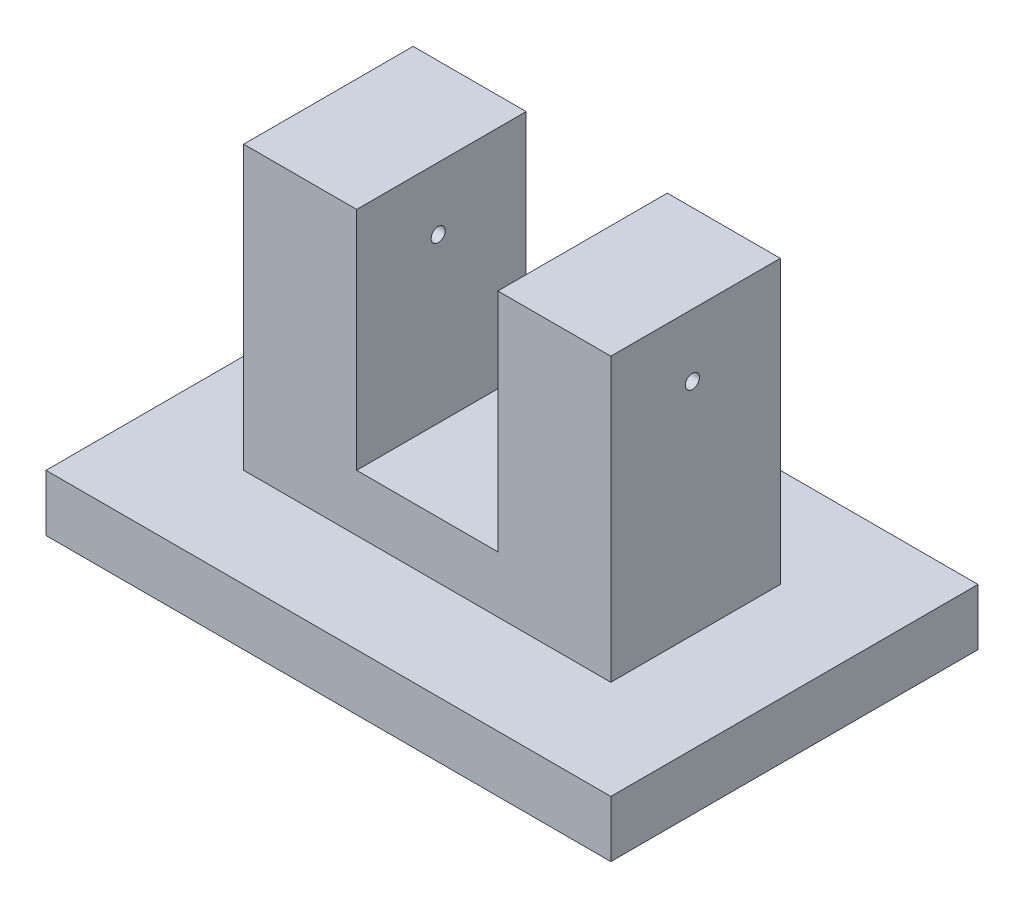
ISO-10303-21;
HEADER;
FILE_DESCRIPTION(('STEP AP214'),'2;1');
FILE_NAME('part.step','',(''),(''),'','','');
FILE_SCHEMA(('AUTOMOTIVE_DESIGN { 1 0 10303 214 1 1 1 1 }'));
ENDSEC;
DATA;
#1=APPLICATION_CONTEXT('core data for automotive mechanical design processes');
#2=APPLICATION_PROTOCOL_DEFINITION('international standard','automotive_design',2000,#1);
#3=PRODUCT_CONTEXT('',#1,'mechanical');
#4=PRODUCT('Part','Part','',(#3));
#5=PRODUCT_RELATED_PRODUCT_CATEGORY('part','',(#4));
#6=PRODUCT_DEFINITION_FORMATION('','',#4);
#7=PRODUCT_DEFINITION_CONTEXT('part definition',#1,'design');
#8=PRODUCT_DEFINITION('design','',#6,#7);
#9=PRODUCT_DEFINITION_SHAPE('','',#8);
#10=(LENGTH_UNIT() NAMED_UNIT(*) SI_UNIT(.MILLI.,.METRE.));
#11=(NAMED_UNIT(*) PLANE_ANGLE_UNIT() SI_UNIT($,.RADIAN.));
#12=(NAMED_UNIT(*) SI_UNIT($,.STERADIAN.) SOLID_ANGLE_UNIT());
#13=UNCERTAINTY_MEASURE_WITH_UNIT(LENGTH_MEASURE(1.E-05),#10,'distance_accuracy_value','');
#14=(GEOMETRIC_REPRESENTATION_CONTEXT(3) GLOBAL_UNCERTAINTY_ASSIGNED_CONTEXT((#13)) GLOBAL_UNIT_ASSIGNED_CONTEXT((#10,
#11,#12)) REPRESENTATION_CONTEXT('',''));
#15=CARTESIAN_POINT('',(0.,0.,0.));
#16=DIRECTION('',(0.,0.,1.));
#17=DIRECTION('',(1.,0.,0.));
#18=AXIS2_PLACEMENT_3D('',#15,#16,#17);
#19=CARTESIAN_POINT('',(0.,4.,0.));
#20=DIRECTION('',(0.,1.,0.));
#21=DIRECTION('',(0.,0.,1.));
#22=AXIS2_PLACEMENT_3D('',#19,#20,#21);
#23=PLANE('',#22);
#24=DIRECTION('',(1.,0.,0.));
#25=VECTOR('',#24,1.);
#26=CARTESIAN_POINT('',(-10.5202702702703,4.,0.699324324324319));
#27=LINE('',#26,#25);
#28=CARTESIAN_POINT('',(-6.52027027027027,4.,0.699324324324319));
#29=VERTEX_POINT('',#28);
#30=CARTESIAN_POINT('',(-1.52027027027028,4.,0.699324324324319));
#31=VERTEX_POINT('',#30);
#32=EDGE_CURVE('E56',#29,#31,#27,.T.);
#33=ORIENTED_EDGE('',*,*,#32,.T.);
#34=DIRECTION('',(0.,0.,1.));
#35=VECTOR('',#34,1.);
#36=CARTESIAN_POINT('',(-1.52027027027027,4.,0.699324324324319));
#37=LINE('',#36,#35);
#38=CARTESIAN_POINT('',(-1.52027027027028,4.,-5.30067567567568));
#39=VERTEX_POINT('',#38);
#40=EDGE_CURVE('E51',#39,#31,#37,.T.);
#41=ORIENTED_EDGE('',*,*,#40,.F.);
#42=DIRECTION('',(-1.,0.,0.));
#43=VECTOR('',#42,1.);
#44=CARTESIAN_POINT('',(-10.5202702702703,4.,-5.30067567567568));
#45=LINE('',#44,#43);
#46=CARTESIAN_POINT('',(-6.52027027027027,4.,-5.30067567567568));
#47=VERTEX_POINT('',#46);
#48=EDGE_CURVE('E180',#39,#47,#45,.T.);
#49=ORIENTED_EDGE('',*,*,#48,.T.);
#50=DIRECTION('',(0.,0.,-1.));
#51=VECTOR('',#50,1.);
#52=CARTESIAN_POINT('',(-6.52027027027027,4.,-5.30067567567568));
#53=LINE('',#52,#51);
#54=EDGE_CURVE('E161',#29,#47,#53,.T.);
#55=ORIENTED_EDGE('',*,*,#54,.F.);
#56=EDGE_LOOP('',(#33,#41,#49,#55));
#57=FACE_BOUND('',#56,.T.);
#58=ADVANCED_FACE('F35',(#57),#23,.T.);
#59=CARTESIAN_POINT('',(5.97972972972973,2.,-8.80067567567568));
#60=DIRECTION('',(-1.,0.,0.));
#61=DIRECTION('',(0.,0.,1.));
#62=AXIS2_PLACEMENT_3D('',#59,#60,#61);
#63=PLANE('',#62);
#64=DIRECTION('',(0.,0.,-1.));
#65=VECTOR('',#64,1.);
#66=CARTESIAN_POINT('',(5.97972972972973,0.,-8.80067567567568));
#67=LINE('',#66,#65);
#68=CARTESIAN_POINT('',(5.97972972972973,0.,4.19932432432432));
#69=VERTEX_POINT('',#68);
#70=CARTESIAN_POINT('',(5.97972972972973,0.,-8.80067567567568));
#71=VERTEX_POINT('',#70);
#72=EDGE_CURVE('E133',#69,#71,#67,.T.);
#73=ORIENTED_EDGE('',*,*,#72,.T.);
#74=DIRECTION('',(0.,-1.,0.));
#75=VECTOR('',#74,1.);
#76=CARTESIAN_POINT('',(5.97972972972973,2.,-8.80067567567568));
#77=LINE('',#76,#75);
#78=CARTESIAN_POINT('',(5.97972972972973,2.,-8.80067567567568));
#79=VERTEX_POINT('',#78);
#80=EDGE_CURVE('E11',#79,#71,#77,.T.);
#81=ORIENTED_EDGE('',*,*,#80,.F.);
#82=DIRECTION('',(0.,0.,-1.));
#83=VECTOR('',#82,1.);
#84=CARTESIAN_POINT('',(5.97972972972973,2.,-8.80067567567568));
#85=LINE('',#84,#83);
#86=CARTESIAN_POINT('',(5.97972972972973,2.,4.19932432432432));
#87=VERTEX_POINT('',#86);
#88=EDGE_CURVE('E199',#87,#79,#85,.T.);
#89=ORIENTED_EDGE('',*,*,#88,.F.);
#90=DIRECTION('',(0.,-1.,0.));
#91=VECTOR('',#90,1.);
#92=CARTESIAN_POINT('',(5.97972972972973,2.,4.19932432432432));
#93=LINE('',#92,#91);
#94=EDGE_CURVE('E209',#87,#69,#93,.T.);
#95=ORIENTED_EDGE('',*,*,#94,.T.);
#96=EDGE_LOOP('',(#73,#81,#89,#95));
#97=FACE_BOUND('',#96,.T.);
#98=ADVANCED_FACE('F37',(#97),#63,.F.);
#99=CARTESIAN_POINT('',(-14.0202702702703,2.,-8.80067567567568));
#100=DIRECTION('',(0.,0.,1.));
#101=DIRECTION('',(1.,0.,0.));
#102=AXIS2_PLACEMENT_3D('',#99,#100,#101);
#103=PLANE('',#102);
#104=DIRECTION('',(-1.,0.,0.));
#105=VECTOR('',#104,1.);
#106=CARTESIAN_POINT('',(-14.0202702702703,0.,-8.80067567567568));
#107=LINE('',#106,#105);
#108=CARTESIAN_POINT('',(-14.0202702702703,0.,-8.80067567567568));
#109=VERTEX_POINT('',#108);
#110=EDGE_CURVE('E212',#71,#109,#107,.T.);
#111=ORIENTED_EDGE('',*,*,#110,.T.);
#112=DIRECTION('',(0.,-1.,0.));
#113=VECTOR('',#112,1.);
#114=CARTESIAN_POINT('',(-14.0202702702703,2.,-8.80067567567568));
#115=LINE('',#114,#113);
#116=CARTESIAN_POINT('',(-14.0202702702703,2.,-8.80067567567568));
#117=VERTEX_POINT('',#116);
#118=EDGE_CURVE('E44',#117,#109,#115,.T.);
#119=ORIENTED_EDGE('',*,*,#118,.F.);
#120=DIRECTION('',(-1.,0.,0.));
#121=VECTOR('',#120,1.);
#122=CARTESIAN_POINT('',(-14.0202702702703,2.,-8.80067567567568));
#123=LINE('',#122,#121);
#124=EDGE_CURVE('E202',#79,#117,#123,.T.);
#125=ORIENTED_EDGE('',*,*,#124,.F.);
#126=ORIENTED_EDGE('',*,*,#80,.T.);
#127=EDGE_LOOP('',(#111,#119,#125,#126));
#128=FACE_BOUND('',#127,.T.);
#129=ADVANCED_FACE('F243',(#128),#103,.F.);
#130=CARTESIAN_POINT('',(-14.0202702702703,2.,-8.80067567567568));
#131=DIRECTION('',(1.,0.,0.));
#132=DIRECTION('',(0.,0.,-1.));
#133=AXIS2_PLACEMENT_3D('',#130,#131,#132);
#134=PLANE('',#133);
#135=DIRECTION('',(0.,0.,1.));
#136=VECTOR('',#135,1.);
#137=CARTESIAN_POINT('',(-14.0202702702703,0.,-8.80067567567568));
#138=LINE('',#137,#136);
#139=CARTESIAN_POINT('',(-14.0202702702703,0.,4.19932432432432));
#140=VERTEX_POINT('',#139);
#141=EDGE_CURVE('E214',#109,#140,#138,.T.);
#142=ORIENTED_EDGE('',*,*,#141,.T.);
#143=DIRECTION('',(0.,-1.,0.));
#144=VECTOR('',#143,1.);
#145=CARTESIAN_POINT('',(-14.0202702702703,2.,4.19932432432432));
#146=LINE('',#145,#144);
#147=CARTESIAN_POINT('',(-14.0202702702703,2.,4.19932432432432));
#148=VERTEX_POINT('',#147);
#149=EDGE_CURVE('E219',#148,#140,#146,.T.);
#150=ORIENTED_EDGE('',*,*,#149,.F.);
#151=DIRECTION('',(0.,0.,1.));
#152=VECTOR('',#151,1.);
#153=CARTESIAN_POINT('',(-14.0202702702703,2.,-8.80067567567568));
#154=LINE('',#153,#152);
#155=EDGE_CURVE('E205',#117,#148,#154,.T.);
#156=ORIENTED_EDGE('',*,*,#155,.F.);
#157=ORIENTED_EDGE('',*,*,#118,.T.);
#158=EDGE_LOOP('',(#142,#150,#156,#157));
#159=FACE_BOUND('',#158,.T.);
#160=ADVANCED_FACE('F227',(#159),#134,.F.);
#161=CARTESIAN_POINT('',(-14.0202702702703,2.,4.19932432432432));
#162=DIRECTION('',(0.,0.,-1.));
#163=DIRECTION('',(-1.,0.,0.));
#164=AXIS2_PLACEMENT_3D('',#161,#162,#163);
#165=PLANE('',#164);
#166=DIRECTION('',(1.,0.,0.));
#167=VECTOR('',#166,1.);
#168=CARTESIAN_POINT('',(-14.0202702702703,0.,4.19932432432432));
#169=LINE('',#168,#167);
#170=EDGE_CURVE('E203',#140,#69,#169,.T.);
#171=ORIENTED_EDGE('',*,*,#170,.T.);
#172=ORIENTED_EDGE('',*,*,#94,.F.);
#173=DIRECTION('',(1.,0.,0.));
#174=VECTOR('',#173,1.);
#175=CARTESIAN_POINT('',(-14.0202702702703,2.,4.19932432432432));
#176=LINE('',#175,#174);
#177=EDGE_CURVE('E207',#148,#87,#176,.T.);
#178=ORIENTED_EDGE('',*,*,#177,.F.);
#179=ORIENTED_EDGE('',*,*,#149,.T.);
#180=EDGE_LOOP('',(#171,#172,#178,#179));
#181=FACE_BOUND('',#180,.T.);
#182=ADVANCED_FACE('F236',(#181),#165,.F.);
#183=CARTESIAN_POINT('',(0.,2.,0.));
#184=DIRECTION('',(0.,1.,0.));
#185=DIRECTION('',(0.,0.,1.));
#186=AXIS2_PLACEMENT_3D('',#183,#184,#185);
#187=PLANE('',#186);
#188=DIRECTION('',(0.,0.,-1.));
#189=VECTOR('',#188,1.);
#190=CARTESIAN_POINT('',(2.47972972972973,2.,-5.30067567567568));
#191=LINE('',#190,#189);
#192=CARTESIAN_POINT('',(2.47972972972973,2.,0.699324324324319));
#193=VERTEX_POINT('',#192);
#194=CARTESIAN_POINT('',(2.47972972972973,2.,-5.30067567567568));
#195=VERTEX_POINT('',#194);
#196=EDGE_CURVE('E130',#193,#195,#191,.T.);
#197=ORIENTED_EDGE('',*,*,#196,.F.);
#198=DIRECTION('',(1.,0.,0.));
#199=VECTOR('',#198,1.);
#200=CARTESIAN_POINT('',(-10.5202702702703,2.,0.699324324324319));
#201=LINE('',#200,#199);
#202=CARTESIAN_POINT('',(-10.5202702702703,2.,0.699324324324319));
#203=VERTEX_POINT('',#202);
#204=EDGE_CURVE('E182',#203,#193,#201,.T.);
#205=ORIENTED_EDGE('',*,*,#204,.F.);
#206=DIRECTION('',(0.,0.,1.));
#207=VECTOR('',#206,1.);
#208=CARTESIAN_POINT('',(-10.5202702702703,2.,-5.30067567567568));
#209=LINE('',#208,#207);
#210=CARTESIAN_POINT('',(-10.5202702702703,2.,-5.30067567567568));
#211=VERTEX_POINT('',#210);
#212=EDGE_CURVE('E188',#211,#203,#209,.T.);
#213=ORIENTED_EDGE('',*,*,#212,.F.);
#214=DIRECTION('',(-1.,0.,0.));
#215=VECTOR('',#214,1.);
#216=CARTESIAN_POINT('',(-10.5202702702703,2.,-5.30067567567568));
#217=LINE('',#216,#215);
#218=EDGE_CURVE('E186',#195,#211,#217,.T.);
#219=ORIENTED_EDGE('',*,*,#218,.F.);
#220=EDGE_LOOP('',(#197,#205,#213,#219));
#221=FACE_BOUND('',#220,.T.);
#222=ORIENTED_EDGE('',*,*,#88,.T.);
#223=ORIENTED_EDGE('',*,*,#124,.T.);
#224=ORIENTED_EDGE('',*,*,#155,.T.);
#225=ORIENTED_EDGE('',*,*,#177,.T.);
#226=EDGE_LOOP('',(#222,#223,#224,#225));
#227=FACE_BOUND('',#226,.T.);
#228=ADVANCED_FACE('F242',(#221,#227),#187,.T.);
#229=CARTESIAN_POINT('',(0.,0.,0.));
#230=DIRECTION('',(0.,1.,0.));
#231=DIRECTION('',(0.,0.,1.));
#232=AXIS2_PLACEMENT_3D('',#229,#230,#231);
#233=PLANE('',#232);
#234=ORIENTED_EDGE('',*,*,#72,.F.);
#235=ORIENTED_EDGE('',*,*,#170,.F.);
#236=ORIENTED_EDGE('',*,*,#141,.F.);
#237=ORIENTED_EDGE('',*,*,#110,.F.);
#238=EDGE_LOOP('',(#234,#235,#236,#237));
#239=FACE_BOUND('',#238,.T.);
#240=ADVANCED_FACE('F233',(#239),#233,.F.);
#241=CARTESIAN_POINT('',(2.47972972972973,4.,-5.30067567567568));
#242=DIRECTION('',(-1.,0.,0.));
#243=DIRECTION('',(0.,0.,1.));
#244=AXIS2_PLACEMENT_3D('',#241,#242,#243);
#245=PLANE('',#244);
#246=CARTESIAN_POINT('',(2.47972972972973,9.78401799754636,-2.18768703186356));
#247=DIRECTION('',(-1.,0.,0.));
#248=DIRECTION('',(0.,0.,1.));
#249=AXIS2_PLACEMENT_3D('',#246,#247,#248);
#250=CIRCLE('',#249,0.25);
#251=CARTESIAN_POINT('',(2.47972972972973,9.78401799754636,-1.93768703186356));
#252=VERTEX_POINT('',#251);
#253=EDGE_CURVE('E150',#252,#252,#250,.T.);
#254=ORIENTED_EDGE('',*,*,#253,.T.);
#255=EDGE_LOOP('',(#254));
#256=FACE_BOUND('',#255,.T.);
#257=ORIENTED_EDGE('',*,*,#196,.T.);
#258=DIRECTION('',(0.,-1.,0.));
#259=VECTOR('',#258,1.);
#260=CARTESIAN_POINT('',(2.47972972972973,4.,-5.30067567567568));
#261=LINE('',#260,#259);
#262=CARTESIAN_POINT('',(2.47972972972973,12.,-5.30067567567568));
#263=VERTEX_POINT('',#262);
#264=EDGE_CURVE('E124',#263,#195,#261,.T.);
#265=ORIENTED_EDGE('',*,*,#264,.F.);
#266=DIRECTION('',(0.,0.,-1.));
#267=VECTOR('',#266,1.);
#268=CARTESIAN_POINT('',(2.47972972972973,12.,0.699324324324319));
#269=LINE('',#268,#267);
#270=CARTESIAN_POINT('',(2.47972972972973,12.,0.699324324324319));
#271=VERTEX_POINT('',#270);
#272=EDGE_CURVE('E129',#271,#263,#269,.T.);
#273=ORIENTED_EDGE('',*,*,#272,.F.);
#274=DIRECTION('',(0.,-1.,0.));
#275=VECTOR('',#274,1.);
#276=CARTESIAN_POINT('',(2.47972972972973,4.,0.699324324324319));
#277=LINE('',#276,#275);
#278=EDGE_CURVE('E184',#271,#193,#277,.T.);
#279=ORIENTED_EDGE('',*,*,#278,.T.);
#280=EDGE_LOOP('',(#257,#265,#273,#279));
#281=FACE_BOUND('',#280,.T.);
#282=ADVANCED_FACE('F126',(#256,#281),#245,.F.);
#283=CARTESIAN_POINT('',(-10.5202702702703,4.,-5.30067567567568));
#284=DIRECTION('',(0.,0.,1.));
#285=DIRECTION('',(1.,0.,0.));
#286=AXIS2_PLACEMENT_3D('',#283,#284,#285);
#287=PLANE('',#286);
#288=ORIENTED_EDGE('',*,*,#218,.T.);
#289=DIRECTION('',(0.,-1.,0.));
#290=VECTOR('',#289,1.);
#291=CARTESIAN_POINT('',(-10.5202702702703,4.,-5.30067567567568));
#292=LINE('',#291,#290);
#293=CARTESIAN_POINT('',(-10.5202702702703,12.,-5.30067567567568));
#294=VERTEX_POINT('',#293);
#295=EDGE_CURVE('E134',#294,#211,#292,.T.);
#296=ORIENTED_EDGE('',*,*,#295,.F.);
#297=DIRECTION('',(-1.,0.,0.));
#298=VECTOR('',#297,1.);
#299=CARTESIAN_POINT('',(-10.5202702702703,12.,-5.30067567567568));
#300=LINE('',#299,#298);
#301=CARTESIAN_POINT('',(-6.52027027027027,12.,-5.30067567567568));
#302=VERTEX_POINT('',#301);
#303=EDGE_CURVE('E169',#302,#294,#300,.T.);
#304=ORIENTED_EDGE('',*,*,#303,.F.);
#305=DIRECTION('',(0.,-1.,0.));
#306=VECTOR('',#305,1.);
#307=CARTESIAN_POINT('',(-6.52027027027027,12.,-5.30067567567568));
#308=LINE('',#307,#306);
#309=EDGE_CURVE('E172',#302,#47,#308,.T.);
#310=ORIENTED_EDGE('',*,*,#309,.T.);
#311=ORIENTED_EDGE('',*,*,#48,.F.);
#312=DIRECTION('',(0.,-1.,0.));
#313=VECTOR('',#312,1.);
#314=CARTESIAN_POINT('',(-1.52027027027027,12.,-5.30067567567568));
#315=LINE('',#314,#313);
#316=CARTESIAN_POINT('',(-1.52027027027027,12.,-5.30067567567568));
#317=VERTEX_POINT('',#316);
#318=EDGE_CURVE('E140',#317,#39,#315,.T.);
#319=ORIENTED_EDGE('',*,*,#318,.F.);
#320=DIRECTION('',(-1.,0.,0.));
#321=VECTOR('',#320,1.);
#322=CARTESIAN_POINT('',(2.47972972972973,12.,-5.30067567567568));
#323=LINE('',#322,#321);
#324=EDGE_CURVE('E137',#263,#317,#323,.T.);
#325=ORIENTED_EDGE('',*,*,#324,.F.);
#326=ORIENTED_EDGE('',*,*,#264,.T.);
#327=EDGE_LOOP('',(#288,#296,#304,#310,#311,#319,#325,#326));
#328=FACE_BOUND('',#327,.T.);
#329=ADVANCED_FACE('F138',(#328),#287,.F.);
#330=CARTESIAN_POINT('',(-10.5202702702703,4.,-5.30067567567568));
#331=DIRECTION('',(1.,0.,0.));
#332=DIRECTION('',(0.,0.,-1.));
#333=AXIS2_PLACEMENT_3D('',#330,#331,#332);
#334=PLANE('',#333);
#335=CARTESIAN_POINT('',(-10.5202702702703,9.78401799754636,-2.18768703186356));
#336=DIRECTION('',(-1.,0.,0.));
#337=DIRECTION('',(0.,0.,1.));
#338=AXIS2_PLACEMENT_3D('',#335,#336,#337);
#339=CIRCLE('',#338,0.25);
#340=CARTESIAN_POINT('',(-10.5202702702703,9.78401799754636,-1.93768703186356));
#341=VERTEX_POINT('',#340);
#342=EDGE_CURVE('E414',#341,#341,#339,.T.);
#343=ORIENTED_EDGE('',*,*,#342,.F.);
#344=EDGE_LOOP('',(#343));
#345=FACE_BOUND('',#344,.T.);
#346=ORIENTED_EDGE('',*,*,#212,.T.);
#347=DIRECTION('',(0.,-1.,0.));
#348=VECTOR('',#347,1.);
#349=CARTESIAN_POINT('',(-10.5202702702703,4.,0.699324324324319));
#350=LINE('',#349,#348);
#351=CARTESIAN_POINT('',(-10.5202702702703,12.,0.699324324324319));
#352=VERTEX_POINT('',#351);
#353=EDGE_CURVE('E194',#352,#203,#350,.T.);
#354=ORIENTED_EDGE('',*,*,#353,.F.);
#355=DIRECTION('',(0.,0.,1.));
#356=VECTOR('',#355,1.);
#357=CARTESIAN_POINT('',(-10.5202702702703,12.,-5.30067567567568));
#358=LINE('',#357,#356);
#359=EDGE_CURVE('E162',#294,#352,#358,.T.);
#360=ORIENTED_EDGE('',*,*,#359,.F.);
#361=ORIENTED_EDGE('',*,*,#295,.T.);
#362=EDGE_LOOP('',(#346,#354,#360,#361));
#363=FACE_BOUND('',#362,.T.);
#364=ADVANCED_FACE('F261',(#345,#363),#334,.F.);
#365=CARTESIAN_POINT('',(-10.5202702702703,4.,0.699324324324319));
#366=DIRECTION('',(0.,0.,-1.));
#367=DIRECTION('',(-1.,0.,0.));
#368=AXIS2_PLACEMENT_3D('',#365,#366,#367);
#369=PLANE('',#368);
#370=ORIENTED_EDGE('',*,*,#204,.T.);
#371=ORIENTED_EDGE('',*,*,#278,.F.);
#372=DIRECTION('',(1.,0.,0.));
#373=VECTOR('',#372,1.);
#374=CARTESIAN_POINT('',(2.47972972972973,12.,0.699324324324319));
#375=LINE('',#374,#373);
#376=CARTESIAN_POINT('',(-1.52027027027027,12.,0.699324324324319));
#377=VERTEX_POINT('',#376);
#378=EDGE_CURVE('E148',#377,#271,#375,.T.);
#379=ORIENTED_EDGE('',*,*,#378,.F.);
#380=DIRECTION('',(0.,-1.,0.));
#381=VECTOR('',#380,1.);
#382=CARTESIAN_POINT('',(-1.52027027027027,12.,0.699324324324319));
#383=LINE('',#382,#381);
#384=EDGE_CURVE('E156',#377,#31,#383,.T.);
#385=ORIENTED_EDGE('',*,*,#384,.T.);
#386=ORIENTED_EDGE('',*,*,#32,.F.);
#387=DIRECTION('',(0.,-1.,0.));
#388=VECTOR('',#387,1.);
#389=CARTESIAN_POINT('',(-6.52027027027027,12.,0.699324324324319));
#390=LINE('',#389,#388);
#391=CARTESIAN_POINT('',(-6.52027027027027,12.,0.699324324324319));
#392=VERTEX_POINT('',#391);
#393=EDGE_CURVE('E177',#392,#29,#390,.T.);
#394=ORIENTED_EDGE('',*,*,#393,.F.);
#395=DIRECTION('',(1.,0.,0.));
#396=VECTOR('',#395,1.);
#397=CARTESIAN_POINT('',(-10.5202702702703,12.,0.699324324324319));
#398=LINE('',#397,#396);
#399=EDGE_CURVE('E165',#352,#392,#398,.T.);
#400=ORIENTED_EDGE('',*,*,#399,.F.);
#401=ORIENTED_EDGE('',*,*,#353,.T.);
#402=EDGE_LOOP('',(#370,#371,#379,#385,#386,#394,#400,#401));
#403=FACE_BOUND('',#402,.T.);
#404=ADVANCED_FACE('F258',(#403),#369,.F.);
#405=CARTESIAN_POINT('',(-6.52027027027027,12.,-5.30067567567568));
#406=DIRECTION('',(-1.,0.,0.));
#407=DIRECTION('',(0.,0.,1.));
#408=AXIS2_PLACEMENT_3D('',#405,#406,#407);
#409=PLANE('',#408);
#410=CARTESIAN_POINT('',(-6.52027027027027,9.78401799754636,-2.18768703186356));
#411=DIRECTION('',(-1.,0.,0.));
#412=DIRECTION('',(0.,0.,1.));
#413=AXIS2_PLACEMENT_3D('',#410,#411,#412);
#414=CIRCLE('',#413,0.25);
#415=CARTESIAN_POINT('',(-6.52027027027027,9.78401799754636,-1.93768703186356));
#416=VERTEX_POINT('',#415);
#417=EDGE_CURVE('E417',#416,#416,#414,.T.);
#418=ORIENTED_EDGE('',*,*,#417,.T.);
#419=EDGE_LOOP('',(#418));
#420=FACE_BOUND('',#419,.T.);
#421=ORIENTED_EDGE('',*,*,#54,.T.);
#422=ORIENTED_EDGE('',*,*,#309,.F.);
#423=DIRECTION('',(0.,0.,-1.));
#424=VECTOR('',#423,1.);
#425=CARTESIAN_POINT('',(-6.52027027027027,12.,-5.30067567567568));
#426=LINE('',#425,#424);
#427=EDGE_CURVE('E167',#392,#302,#426,.T.);
#428=ORIENTED_EDGE('',*,*,#427,.F.);
#429=ORIENTED_EDGE('',*,*,#393,.T.);
#430=EDGE_LOOP('',(#421,#422,#428,#429));
#431=FACE_BOUND('',#430,.T.);
#432=ADVANCED_FACE('F256',(#420,#431),#409,.F.);
#433=CARTESIAN_POINT('',(0.,12.,0.));
#434=DIRECTION('',(0.,1.,0.));
#435=DIRECTION('',(0.,0.,1.));
#436=AXIS2_PLACEMENT_3D('',#433,#434,#435);
#437=PLANE('',#436);
#438=ORIENTED_EDGE('',*,*,#359,.T.);
#439=ORIENTED_EDGE('',*,*,#399,.T.);
#440=ORIENTED_EDGE('',*,*,#427,.T.);
#441=ORIENTED_EDGE('',*,*,#303,.T.);
#442=EDGE_LOOP('',(#438,#439,#440,#441));
#443=FACE_BOUND('',#442,.T.);
#444=ADVANCED_FACE('F313',(#443),#437,.T.);
#445=CARTESIAN_POINT('',(-1.52027027027027,12.,0.699324324324319));
#446=DIRECTION('',(1.,0.,0.));
#447=DIRECTION('',(0.,0.,-1.));
#448=AXIS2_PLACEMENT_3D('',#445,#446,#447);
#449=PLANE('',#448);
#450=CARTESIAN_POINT('',(-1.52027027027027,9.78401799754636,-2.18768703186356));
#451=DIRECTION('',(1.,0.,0.));
#452=DIRECTION('',(0.,0.,-1.));
#453=AXIS2_PLACEMENT_3D('',#450,#451,#452);
#454=CIRCLE('',#453,0.25);
#455=CARTESIAN_POINT('',(-1.52027027027027,9.78401799754636,-2.43768703186356));
#456=VERTEX_POINT('',#455);
#457=EDGE_CURVE('E39',#456,#456,#454,.T.);
#458=ORIENTED_EDGE('',*,*,#457,.T.);
#459=EDGE_LOOP('',(#458));
#460=FACE_BOUND('',#459,.T.);
#461=ORIENTED_EDGE('',*,*,#40,.T.);
#462=ORIENTED_EDGE('',*,*,#384,.F.);
#463=DIRECTION('',(0.,0.,1.));
#464=VECTOR('',#463,1.);
#465=CARTESIAN_POINT('',(-1.52027027027027,12.,0.699324324324319));
#466=LINE('',#465,#464);
#467=EDGE_CURVE('E143',#317,#377,#466,.T.);
#468=ORIENTED_EDGE('',*,*,#467,.F.);
#469=ORIENTED_EDGE('',*,*,#318,.T.);
#470=EDGE_LOOP('',(#461,#462,#468,#469));
#471=FACE_BOUND('',#470,.T.);
#472=ADVANCED_FACE('F320',(#460,#471),#449,.F.);
#473=CARTESIAN_POINT('',(0.,12.,0.));
#474=DIRECTION('',(0.,1.,0.));
#475=DIRECTION('',(0.,0.,1.));
#476=AXIS2_PLACEMENT_3D('',#473,#474,#475);
#477=PLANE('',#476);
#478=ORIENTED_EDGE('',*,*,#272,.T.);
#479=ORIENTED_EDGE('',*,*,#324,.T.);
#480=ORIENTED_EDGE('',*,*,#467,.T.);
#481=ORIENTED_EDGE('',*,*,#378,.T.);
#482=EDGE_LOOP('',(#478,#479,#480,#481));
#483=FACE_BOUND('',#482,.T.);
#484=ADVANCED_FACE('F146',(#483),#477,.T.);
#485=CARTESIAN_POINT('',(5.97972972972973,9.78401799754636,-2.18768703186356));
#486=DIRECTION('',(-1.,0.,0.));
#487=DIRECTION('',(0.,0.,1.));
#488=AXIS2_PLACEMENT_3D('',#485,#486,#487);
#489=CYLINDRICAL_SURFACE('',#488,0.25);
#490=ORIENTED_EDGE('',*,*,#457,.F.);
#491=EDGE_LOOP('',(#490));
#492=FACE_BOUND('',#491,.T.);
#493=ORIENTED_EDGE('',*,*,#253,.F.);
#494=EDGE_LOOP('',(#493));
#495=FACE_BOUND('',#494,.T.);
#496=ADVANCED_FACE('F333',(#492,#495),#489,.F.);
#497=ORIENTED_EDGE('',*,*,#342,.T.);
#498=EDGE_LOOP('',(#497));
#499=FACE_BOUND('',#498,.T.);
#500=ORIENTED_EDGE('',*,*,#417,.F.);
#501=EDGE_LOOP('',(#500));
#502=FACE_BOUND('',#501,.T.);
#503=ADVANCED_FACE('F339',(#499,#502),#489,.F.);
#504=CLOSED_SHELL('',(#58,#98,#129,#160,#182,#228,#240,#282,#329,#364,#404,#432,#444,#472,#484,
#496,#503));
#505=MANIFOLD_SOLID_BREP('B2',#504);
#506=ADVANCED_BREP_SHAPE_REPRESENTATION('',(#18,#505),#14);
#507=SHAPE_DEFINITION_REPRESENTATION(#9,#506);
ENDSEC;
END-ISO-10303-21;
